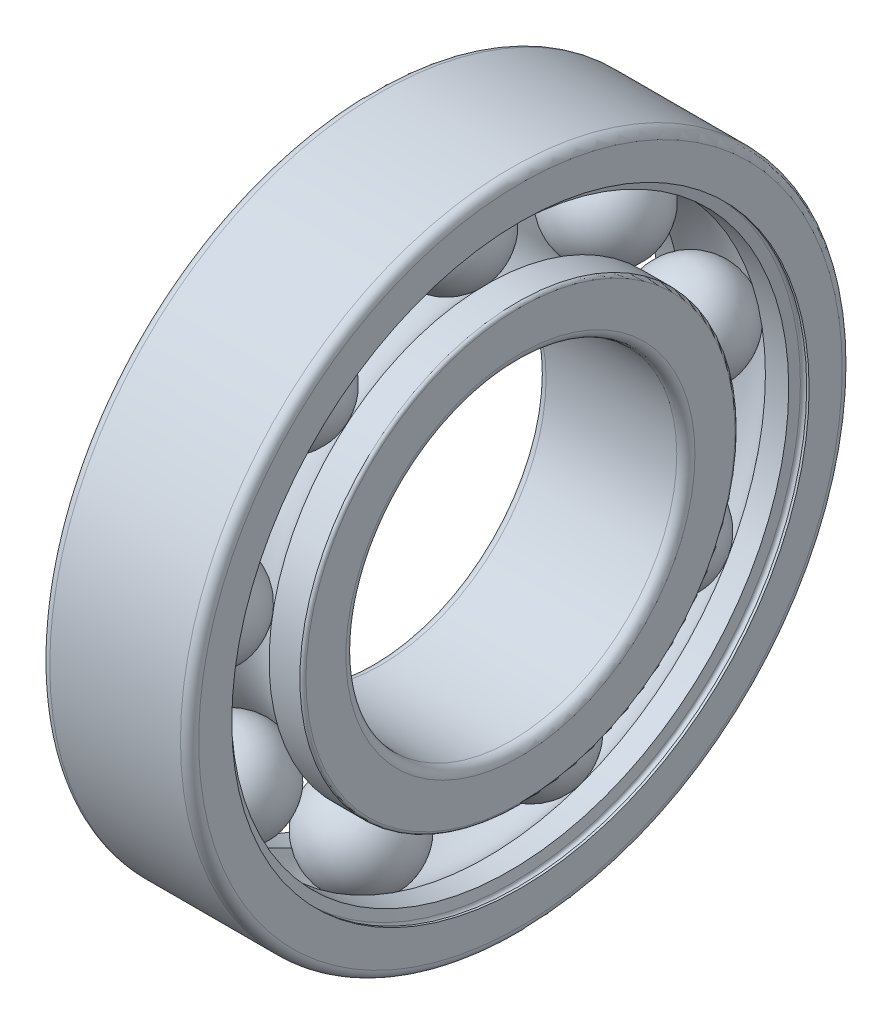
ISO-10303-21;
HEADER;
FILE_DESCRIPTION(('STEP AP214'),'2;1');
FILE_NAME('part.step','',(''),(''),'','','');
FILE_SCHEMA(('AUTOMOTIVE_DESIGN { 1 0 10303 214 1 1 1 1 }'));
ENDSEC;
DATA;
#1=APPLICATION_CONTEXT('core data for automotive mechanical design processes');
#2=APPLICATION_PROTOCOL_DEFINITION('international standard','automotive_design',2000,#1);
#3=PRODUCT_CONTEXT('',#1,'mechanical');
#4=PRODUCT('Part','Part','',(#3));
#5=PRODUCT_RELATED_PRODUCT_CATEGORY('part','',(#4));
#6=PRODUCT_DEFINITION_FORMATION('','',#4);
#7=PRODUCT_DEFINITION_CONTEXT('part definition',#1,'design');
#8=PRODUCT_DEFINITION('design','',#6,#7);
#9=PRODUCT_DEFINITION_SHAPE('','',#8);
#10=(LENGTH_UNIT() NAMED_UNIT(*) SI_UNIT(.MILLI.,.METRE.));
#11=(NAMED_UNIT(*) PLANE_ANGLE_UNIT() SI_UNIT($,.RADIAN.));
#12=(NAMED_UNIT(*) SI_UNIT($,.STERADIAN.) SOLID_ANGLE_UNIT());
#13=UNCERTAINTY_MEASURE_WITH_UNIT(LENGTH_MEASURE(1.E-05),#10,'distance_accuracy_value','');
#14=(GEOMETRIC_REPRESENTATION_CONTEXT(3) GLOBAL_UNCERTAINTY_ASSIGNED_CONTEXT((#13)) GLOBAL_UNIT_ASSIGNED_CONTEXT((#10,
#11,#12)) REPRESENTATION_CONTEXT('',''));
#15=CARTESIAN_POINT('',(0.,0.,0.));
#16=DIRECTION('',(0.,0.,1.));
#17=DIRECTION('',(1.,0.,0.));
#18=AXIS2_PLACEMENT_3D('',#15,#16,#17);
#19=CARTESIAN_POINT('',(1.10000000000032,0.,0.));
#20=DIRECTION('',(1.,0.,0.));
#21=DIRECTION('',(0.,0.,-1.));
#22=AXIS2_PLACEMENT_3D('',#19,#20,#21);
#23=TOROIDAL_SURFACE('',#22,21.1000000000003,1.10000000000035);
#24=CARTESIAN_POINT('',(1.09999999999999,0.,0.));
#25=DIRECTION('',(1.,0.,0.));
#26=DIRECTION('',(0.,0.,-1.));
#27=AXIS2_PLACEMENT_3D('',#24,#25,#26);
#28=CIRCLE('',#27,20.);
#29=CARTESIAN_POINT('',(1.09999999999999,0.,-20.));
#30=VERTEX_POINT('',#29);
#31=EDGE_CURVE('P0_E9',#30,#30,#28,.T.);
#32=ORIENTED_EDGE('',*,*,#31,.T.);
#33=EDGE_LOOP('',(#32));
#34=FACE_BOUND('',#33,.T.);
#35=CARTESIAN_POINT('',(0.,0.,0.));
#36=DIRECTION('',(1.,0.,0.));
#37=DIRECTION('',(0.,0.,-1.));
#38=AXIS2_PLACEMENT_3D('',#35,#36,#37);
#39=CIRCLE('',#38,21.1);
#40=CARTESIAN_POINT('',(0.,0.,-21.1));
#41=VERTEX_POINT('',#40);
#42=EDGE_CURVE('P0_E48',#41,#41,#39,.T.);
#43=ORIENTED_EDGE('',*,*,#42,.F.);
#44=EDGE_LOOP('',(#43));
#45=FACE_BOUND('',#44,.T.);
#46=ADVANCED_FACE('P0_F14',(#34,#45),#23,.T.);
#47=CARTESIAN_POINT('',(16.9,0.,0.));
#48=DIRECTION('',(1.,0.,0.));
#49=DIRECTION('',(0.,0.,-1.));
#50=AXIS2_PLACEMENT_3D('',#47,#48,#49);
#51=CYLINDRICAL_SURFACE('',#50,20.);
#52=CARTESIAN_POINT('',(16.9,0.,0.));
#53=DIRECTION('',(1.,0.,0.));
#54=DIRECTION('',(0.,0.,-1.));
#55=AXIS2_PLACEMENT_3D('',#52,#53,#54);
#56=CIRCLE('',#55,20.);
#57=CARTESIAN_POINT('',(16.9,0.,-20.));
#58=VERTEX_POINT('',#57);
#59=EDGE_CURVE('P0_E20',#58,#58,#56,.T.);
#60=ORIENTED_EDGE('',*,*,#59,.T.);
#61=EDGE_LOOP('',(#60));
#62=FACE_BOUND('',#61,.T.);
#63=ORIENTED_EDGE('',*,*,#31,.F.);
#64=EDGE_LOOP('',(#63));
#65=FACE_BOUND('',#64,.T.);
#66=ADVANCED_FACE('P0_F56',(#62,#65),#51,.F.);
#67=CARTESIAN_POINT('',(16.8999999999993,0.,0.));
#68=DIRECTION('',(1.,0.,0.));
#69=DIRECTION('',(0.,0.,-1.));
#70=AXIS2_PLACEMENT_3D('',#67,#68,#69);
#71=TOROIDAL_SURFACE('',#70,21.1000000000007,1.10000000000069);
#72=CARTESIAN_POINT('',(18.,0.,0.));
#73=DIRECTION('',(1.,0.,0.));
#74=DIRECTION('',(0.,0.,-1.));
#75=AXIS2_PLACEMENT_3D('',#72,#73,#74);
#76=CIRCLE('',#75,21.1);
#77=CARTESIAN_POINT('',(18.,0.,-21.1));
#78=VERTEX_POINT('',#77);
#79=EDGE_CURVE('P0_E24',#78,#78,#76,.T.);
#80=ORIENTED_EDGE('',*,*,#79,.T.);
#81=EDGE_LOOP('',(#80));
#82=FACE_BOUND('',#81,.T.);
#83=ORIENTED_EDGE('',*,*,#59,.F.);
#84=EDGE_LOOP('',(#83));
#85=FACE_BOUND('',#84,.T.);
#86=ADVANCED_FACE('P0_F61',(#82,#85),#71,.T.);
#87=CARTESIAN_POINT('',(18.,21.1,0.));
#88=DIRECTION('',(1.,0.,0.));
#89=DIRECTION('',(0.,0.,-1.));
#90=AXIS2_PLACEMENT_3D('',#87,#88,#89);
#91=PLANE('',#90);
#92=CARTESIAN_POINT('',(18.,0.,0.));
#93=DIRECTION('',(1.,0.,0.));
#94=DIRECTION('',(0.,0.,-1.));
#95=AXIS2_PLACEMENT_3D('',#92,#93,#94);
#96=CIRCLE('',#95,25.933);
#97=CARTESIAN_POINT('',(18.,0.,-25.933));
#98=VERTEX_POINT('',#97);
#99=EDGE_CURVE('P0_E28',#98,#98,#96,.T.);
#100=ORIENTED_EDGE('',*,*,#99,.T.);
#101=EDGE_LOOP('',(#100));
#102=FACE_BOUND('',#101,.T.);
#103=ORIENTED_EDGE('',*,*,#79,.F.);
#104=EDGE_LOOP('',(#103));
#105=FACE_BOUND('',#104,.T.);
#106=ADVANCED_FACE('P0_F65',(#102,#105),#91,.T.);
#107=CARTESIAN_POINT('',(17.6329999999984,0.,0.));
#108=DIRECTION('',(1.,0.,0.));
#109=DIRECTION('',(0.,0.,-1.));
#110=AXIS2_PLACEMENT_3D('',#107,#108,#109);
#111=TOROIDAL_SURFACE('',#110,25.9329999999984,0.367000000001578);
#112=CARTESIAN_POINT('',(17.633,0.,0.));
#113=DIRECTION('',(1.,0.,0.));
#114=DIRECTION('',(0.,0.,-1.));
#115=AXIS2_PLACEMENT_3D('',#112,#113,#114);
#116=CIRCLE('',#115,26.3);
#117=CARTESIAN_POINT('',(17.633,0.,-26.3));
#118=VERTEX_POINT('',#117);
#119=EDGE_CURVE('P0_E33',#118,#118,#116,.T.);
#120=ORIENTED_EDGE('',*,*,#119,.T.);
#121=EDGE_LOOP('',(#120));
#122=FACE_BOUND('',#121,.T.);
#123=ORIENTED_EDGE('',*,*,#99,.F.);
#124=EDGE_LOOP('',(#123));
#125=FACE_BOUND('',#124,.T.);
#126=ADVANCED_FACE('P0_F72',(#122,#125),#111,.T.);
#127=CARTESIAN_POINT('',(16.9,0.,0.));
#128=DIRECTION('',(1.,0.,0.));
#129=DIRECTION('',(0.,0.,-1.));
#130=AXIS2_PLACEMENT_3D('',#127,#128,#129);
#131=CYLINDRICAL_SURFACE('',#130,26.3);
#132=CARTESIAN_POINT('',(13.914987690727,0.,0.));
#133=DIRECTION('',(1.,0.,0.));
#134=DIRECTION('',(0.,0.,-1.));
#135=AXIS2_PLACEMENT_3D('',#132,#133,#134);
#136=CIRCLE('',#135,26.3);
#137=CARTESIAN_POINT('',(13.914987690727,0.,-26.3));
#138=VERTEX_POINT('',#137);
#139=EDGE_CURVE('P0_E36',#138,#138,#136,.T.);
#140=ORIENTED_EDGE('',*,*,#139,.T.);
#141=EDGE_LOOP('',(#140));
#142=FACE_BOUND('',#141,.T.);
#143=ORIENTED_EDGE('',*,*,#119,.F.);
#144=EDGE_LOOP('',(#143));
#145=FACE_BOUND('',#144,.T.);
#146=ADVANCED_FACE('P0_F76',(#142,#145),#131,.T.);
#147=CARTESIAN_POINT('',(8.9999999999999,0.,0.));
#148=DIRECTION('',(1.,0.,0.));
#149=DIRECTION('',(0.,0.,-1.));
#150=AXIS2_PLACEMENT_3D('',#147,#148,#149);
#151=TOROIDAL_SURFACE('',#150,29.9999999999998,6.15199999999978);
#152=CARTESIAN_POINT('',(4.08501230927283,0.,0.));
#153=DIRECTION('',(1.,0.,0.));
#154=DIRECTION('',(0.,0.,-1.));
#155=AXIS2_PLACEMENT_3D('',#152,#153,#154);
#156=CIRCLE('',#155,26.3);
#157=CARTESIAN_POINT('',(4.08501230927283,0.,-26.3));
#158=VERTEX_POINT('',#157);
#159=EDGE_CURVE('P0_E39',#158,#158,#156,.T.);
#160=ORIENTED_EDGE('',*,*,#159,.T.);
#161=EDGE_LOOP('',(#160));
#162=FACE_BOUND('',#161,.T.);
#163=ORIENTED_EDGE('',*,*,#139,.F.);
#164=EDGE_LOOP('',(#163));
#165=FACE_BOUND('',#164,.T.);
#166=ADVANCED_FACE('P0_F80',(#162,#165),#151,.F.);
#167=CARTESIAN_POINT('',(16.9,0.,0.));
#168=DIRECTION('',(1.,0.,0.));
#169=DIRECTION('',(0.,0.,-1.));
#170=AXIS2_PLACEMENT_3D('',#167,#168,#169);
#171=CYLINDRICAL_SURFACE('',#170,26.3);
#172=CARTESIAN_POINT('',(0.367000000000006,0.,0.));
#173=DIRECTION('',(1.,0.,0.));
#174=DIRECTION('',(0.,0.,-1.));
#175=AXIS2_PLACEMENT_3D('',#172,#173,#174);
#176=CIRCLE('',#175,26.3);
#177=CARTESIAN_POINT('',(0.367000000000006,0.,-26.3));
#178=VERTEX_POINT('',#177);
#179=EDGE_CURVE('P0_E42',#178,#178,#176,.T.);
#180=ORIENTED_EDGE('',*,*,#179,.T.);
#181=EDGE_LOOP('',(#180));
#182=FACE_BOUND('',#181,.T.);
#183=ORIENTED_EDGE('',*,*,#159,.F.);
#184=EDGE_LOOP('',(#183));
#185=FACE_BOUND('',#184,.T.);
#186=ADVANCED_FACE('P0_F84',(#182,#185),#171,.T.);
#187=CARTESIAN_POINT('',(0.367000000000783,0.,0.));
#188=DIRECTION('',(1.,0.,0.));
#189=DIRECTION('',(0.,0.,-1.));
#190=AXIS2_PLACEMENT_3D('',#187,#188,#189);
#191=TOROIDAL_SURFACE('',#190,25.9329999999992,0.367000000000794);
#192=CARTESIAN_POINT('',(0.,0.,0.));
#193=DIRECTION('',(1.,0.,0.));
#194=DIRECTION('',(0.,0.,-1.));
#195=AXIS2_PLACEMENT_3D('',#192,#193,#194);
#196=CIRCLE('',#195,25.933);
#197=CARTESIAN_POINT('',(0.,0.,-25.933));
#198=VERTEX_POINT('',#197);
#199=EDGE_CURVE('P0_E45',#198,#198,#196,.T.);
#200=ORIENTED_EDGE('',*,*,#199,.T.);
#201=EDGE_LOOP('',(#200));
#202=FACE_BOUND('',#201,.T.);
#203=ORIENTED_EDGE('',*,*,#179,.F.);
#204=EDGE_LOOP('',(#203));
#205=FACE_BOUND('',#204,.T.);
#206=ADVANCED_FACE('P0_F88',(#202,#205),#191,.T.);
#207=CARTESIAN_POINT('',(0.,25.933,0.));
#208=DIRECTION('',(-1.,0.,0.));
#209=DIRECTION('',(0.,0.,1.));
#210=AXIS2_PLACEMENT_3D('',#207,#208,#209);
#211=PLANE('',#210);
#212=ORIENTED_EDGE('',*,*,#42,.T.);
#213=EDGE_LOOP('',(#212));
#214=FACE_BOUND('',#213,.T.);
#215=ORIENTED_EDGE('',*,*,#199,.F.);
#216=EDGE_LOOP('',(#215));
#217=FACE_BOUND('',#216,.T.);
#218=ADVANCED_FACE('P0_F52',(#214,#217),#211,.T.);
#219=CLOSED_SHELL('',(#46,#66,#86,#106,#126,#146,#166,#186,#206,#218));
#220=MANIFOLD_SOLID_BREP('P0_B1',#219);
#221=CARTESIAN_POINT('',(1.10000000000032,0.,0.));
#222=DIRECTION('',(1.,0.,0.));
#223=DIRECTION('',(0.,0.,-1.));
#224=AXIS2_PLACEMENT_3D('',#221,#222,#223);
#225=TOROIDAL_SURFACE('',#224,38.8999999999997,1.10000000000034);
#226=CARTESIAN_POINT('',(0.,0.,0.));
#227=DIRECTION('',(1.,0.,0.));
#228=DIRECTION('',(0.,0.,-1.));
#229=AXIS2_PLACEMENT_3D('',#226,#227,#228);
#230=CIRCLE('',#229,38.9);
#231=CARTESIAN_POINT('',(0.,0.,-38.9));
#232=VERTEX_POINT('',#231);
#233=EDGE_CURVE('P1_E10',#232,#232,#230,.T.);
#234=ORIENTED_EDGE('',*,*,#233,.T.);
#235=EDGE_LOOP('',(#234));
#236=FACE_BOUND('',#235,.T.);
#237=CARTESIAN_POINT('',(1.09999999999999,0.,0.));
#238=DIRECTION('',(1.,0.,0.));
#239=DIRECTION('',(0.,0.,-1.));
#240=AXIS2_PLACEMENT_3D('',#237,#238,#239);
#241=CIRCLE('',#240,40.);
#242=CARTESIAN_POINT('',(1.09999999999999,0.,-40.));
#243=VERTEX_POINT('',#242);
#244=EDGE_CURVE('P1_E61',#243,#243,#241,.T.);
#245=ORIENTED_EDGE('',*,*,#244,.F.);
#246=EDGE_LOOP('',(#245));
#247=FACE_BOUND('',#246,.T.);
#248=ADVANCED_FACE('P1_F15',(#236,#247),#225,.T.);
#249=CARTESIAN_POINT('',(0.,38.9,0.));
#250=DIRECTION('',(-1.,0.,0.));
#251=DIRECTION('',(0.,0.,1.));
#252=AXIS2_PLACEMENT_3D('',#249,#250,#251);
#253=PLANE('',#252);
#254=CARTESIAN_POINT('',(0.,0.,0.));
#255=DIRECTION('',(1.,0.,0.));
#256=DIRECTION('',(0.,0.,-1.));
#257=AXIS2_PLACEMENT_3D('',#254,#255,#256);
#258=CIRCLE('',#257,34.9);
#259=CARTESIAN_POINT('',(0.,0.,-34.9));
#260=VERTEX_POINT('',#259);
#261=EDGE_CURVE('P1_E21',#260,#260,#258,.T.);
#262=ORIENTED_EDGE('',*,*,#261,.T.);
#263=EDGE_LOOP('',(#262));
#264=FACE_BOUND('',#263,.T.);
#265=ORIENTED_EDGE('',*,*,#233,.F.);
#266=EDGE_LOOP('',(#265));
#267=FACE_BOUND('',#266,.T.);
#268=ADVANCED_FACE('P1_F69',(#264,#267),#253,.T.);
#269=CARTESIAN_POINT('',(16.9,0.,0.));
#270=DIRECTION('',(1.,0.,0.));
#271=DIRECTION('',(0.,0.,-1.));
#272=AXIS2_PLACEMENT_3D('',#269,#270,#271);
#273=CYLINDRICAL_SURFACE('',#272,34.9);
#274=CARTESIAN_POINT('',(0.295555555555549,0.,0.));
#275=DIRECTION('',(1.,0.,0.));
#276=DIRECTION('',(0.,0.,-1.));
#277=AXIS2_PLACEMENT_3D('',#274,#275,#276);
#278=CIRCLE('',#277,34.9);
#279=CARTESIAN_POINT('',(0.295555555555549,0.,-34.9));
#280=VERTEX_POINT('',#279);
#281=EDGE_CURVE('P1_E25',#280,#280,#278,.T.);
#282=ORIENTED_EDGE('',*,*,#281,.T.);
#283=EDGE_LOOP('',(#282));
#284=FACE_BOUND('',#283,.T.);
#285=ORIENTED_EDGE('',*,*,#261,.F.);
#286=EDGE_LOOP('',(#285));
#287=FACE_BOUND('',#286,.T.);
#288=ADVANCED_FACE('P1_F74',(#284,#287),#273,.F.);
#289=CARTESIAN_POINT('',(0.675555555555596,0.,0.));
#290=DIRECTION('',(1.,0.,0.));
#291=DIRECTION('',(0.,0.,-1.));
#292=AXIS2_PLACEMENT_3D('',#289,#290,#291);
#293=TOROIDAL_SURFACE('',#292,34.9,0.380000000000025);
#294=CARTESIAN_POINT('',(1.05555555555559,0.,0.));
#295=DIRECTION('',(1.,0.,0.));
#296=DIRECTION('',(0.,0.,-1.));
#297=AXIS2_PLACEMENT_3D('',#294,#295,#296);
#298=CIRCLE('',#297,34.9);
#299=CARTESIAN_POINT('',(1.05555555555559,0.,-34.9));
#300=VERTEX_POINT('',#299);
#301=EDGE_CURVE('P1_E29',#300,#300,#298,.T.);
#302=ORIENTED_EDGE('',*,*,#301,.T.);
#303=EDGE_LOOP('',(#302));
#304=FACE_BOUND('',#303,.T.);
#305=ORIENTED_EDGE('',*,*,#281,.F.);
#306=EDGE_LOOP('',(#305));
#307=FACE_BOUND('',#306,.T.);
#308=ADVANCED_FACE('P1_F78',(#304,#307),#293,.F.);
#309=CARTESIAN_POINT('',(1.05555555555559,0.,0.));
#310=DIRECTION('',(-1.,0.,0.));
#311=DIRECTION('',(0.,0.,1.));
#312=AXIS2_PLACEMENT_3D('',#309,#310,#311);
#313=CONICAL_SURFACE('',#312,34.9,1.39626340159551);
#314=CARTESIAN_POINT('',(1.26714793240568,0.,0.));
#315=DIRECTION('',(1.,0.,0.));
#316=DIRECTION('',(0.,0.,-1.));
#317=AXIS2_PLACEMENT_3D('',#314,#315,#316);
#318=CIRCLE('',#317,33.7);
#319=CARTESIAN_POINT('',(1.26714793240568,0.,-33.7));
#320=VERTEX_POINT('',#319);
#321=EDGE_CURVE('P1_E34',#320,#320,#318,.T.);
#322=ORIENTED_EDGE('',*,*,#321,.T.);
#323=EDGE_LOOP('',(#322));
#324=FACE_BOUND('',#323,.T.);
#325=ORIENTED_EDGE('',*,*,#301,.F.);
#326=EDGE_LOOP('',(#325));
#327=FACE_BOUND('',#326,.T.);
#328=ADVANCED_FACE('P1_F85',(#324,#327),#313,.F.);
#329=CARTESIAN_POINT('',(16.9,0.,0.));
#330=DIRECTION('',(1.,0.,0.));
#331=DIRECTION('',(0.,0.,-1.));
#332=AXIS2_PLACEMENT_3D('',#329,#330,#331);
#333=CYLINDRICAL_SURFACE('',#332,33.7);
#334=CARTESIAN_POINT('',(4.08501230927283,0.,0.));
#335=DIRECTION('',(1.,0.,0.));
#336=DIRECTION('',(0.,0.,-1.));
#337=AXIS2_PLACEMENT_3D('',#334,#335,#336);
#338=CIRCLE('',#337,33.7);
#339=CARTESIAN_POINT('',(4.08501230927283,0.,-33.7));
#340=VERTEX_POINT('',#339);
#341=EDGE_CURVE('P1_E37',#340,#340,#338,.T.);
#342=ORIENTED_EDGE('',*,*,#341,.T.);
#343=EDGE_LOOP('',(#342));
#344=FACE_BOUND('',#343,.T.);
#345=ORIENTED_EDGE('',*,*,#321,.F.);
#346=EDGE_LOOP('',(#345));
#347=FACE_BOUND('',#346,.T.);
#348=ADVANCED_FACE('P1_F89',(#344,#347),#333,.F.);
#349=CARTESIAN_POINT('',(8.9999999999999,0.,0.));
#350=DIRECTION('',(1.,0.,0.));
#351=DIRECTION('',(0.,0.,-1.));
#352=AXIS2_PLACEMENT_3D('',#349,#350,#351);
#353=TOROIDAL_SURFACE('',#352,30.0000000000002,6.15199999999979);
#354=CARTESIAN_POINT('',(13.914987690727,0.,0.));
#355=DIRECTION('',(1.,0.,0.));
#356=DIRECTION('',(0.,0.,-1.));
#357=AXIS2_PLACEMENT_3D('',#354,#355,#356);
#358=CIRCLE('',#357,33.7);
#359=CARTESIAN_POINT('',(13.914987690727,0.,-33.7));
#360=VERTEX_POINT('',#359);
#361=EDGE_CURVE('P1_E40',#360,#360,#358,.T.);
#362=ORIENTED_EDGE('',*,*,#361,.T.);
#363=EDGE_LOOP('',(#362));
#364=FACE_BOUND('',#363,.T.);
#365=ORIENTED_EDGE('',*,*,#341,.F.);
#366=EDGE_LOOP('',(#365));
#367=FACE_BOUND('',#366,.T.);
#368=ADVANCED_FACE('P1_F93',(#364,#367),#353,.F.);
#369=CARTESIAN_POINT('',(16.9,0.,0.));
#370=DIRECTION('',(1.,0.,0.));
#371=DIRECTION('',(0.,0.,-1.));
#372=AXIS2_PLACEMENT_3D('',#369,#370,#371);
#373=CYLINDRICAL_SURFACE('',#372,33.7);
#374=CARTESIAN_POINT('',(16.732852067594,0.,0.));
#375=DIRECTION('',(1.,0.,0.));
#376=DIRECTION('',(0.,0.,-1.));
#377=AXIS2_PLACEMENT_3D('',#374,#375,#376);
#378=CIRCLE('',#377,33.7);
#379=CARTESIAN_POINT('',(16.732852067594,0.,-33.7));
#380=VERTEX_POINT('',#379);
#381=EDGE_CURVE('P1_E43',#380,#380,#378,.T.);
#382=ORIENTED_EDGE('',*,*,#381,.T.);
#383=EDGE_LOOP('',(#382));
#384=FACE_BOUND('',#383,.T.);
#385=ORIENTED_EDGE('',*,*,#361,.F.);
#386=EDGE_LOOP('',(#385));
#387=FACE_BOUND('',#386,.T.);
#388=ADVANCED_FACE('P1_F97',(#384,#387),#373,.F.);
#389=CARTESIAN_POINT('',(16.732852067594,0.,0.));
#390=DIRECTION('',(1.,0.,0.));
#391=DIRECTION('',(0.,0.,-1.));
#392=AXIS2_PLACEMENT_3D('',#389,#390,#391);
#393=CONICAL_SURFACE('',#392,33.7,1.39626340159559);
#394=CARTESIAN_POINT('',(16.944444444444,0.,0.));
#395=DIRECTION('',(1.,0.,0.));
#396=DIRECTION('',(0.,0.,-1.));
#397=AXIS2_PLACEMENT_3D('',#394,#395,#396);
#398=CIRCLE('',#397,34.9);
#399=CARTESIAN_POINT('',(16.944444444444,0.,-34.9));
#400=VERTEX_POINT('',#399);
#401=EDGE_CURVE('P1_E46',#400,#400,#398,.T.);
#402=ORIENTED_EDGE('',*,*,#401,.T.);
#403=EDGE_LOOP('',(#402));
#404=FACE_BOUND('',#403,.T.);
#405=ORIENTED_EDGE('',*,*,#381,.F.);
#406=EDGE_LOOP('',(#405));
#407=FACE_BOUND('',#406,.T.);
#408=ADVANCED_FACE('P1_F101',(#404,#407),#393,.F.);
#409=CARTESIAN_POINT('',(17.324444444444,0.,0.));
#410=DIRECTION('',(1.,0.,0.));
#411=DIRECTION('',(0.,0.,-1.));
#412=AXIS2_PLACEMENT_3D('',#409,#410,#411);
#413=TOROIDAL_SURFACE('',#412,34.900000027375,0.380000000000001);
#414=CARTESIAN_POINT('',(17.704444444444,0.,0.));
#415=DIRECTION('',(1.,0.,0.));
#416=DIRECTION('',(0.,0.,-1.));
#417=AXIS2_PLACEMENT_3D('',#414,#415,#416);
#418=CIRCLE('',#417,34.9);
#419=CARTESIAN_POINT('',(17.704444444444,0.,-34.9));
#420=VERTEX_POINT('',#419);
#421=EDGE_CURVE('P1_E49',#420,#420,#418,.T.);
#422=ORIENTED_EDGE('',*,*,#421,.T.);
#423=EDGE_LOOP('',(#422));
#424=FACE_BOUND('',#423,.T.);
#425=ORIENTED_EDGE('',*,*,#401,.F.);
#426=EDGE_LOOP('',(#425));
#427=FACE_BOUND('',#426,.T.);
#428=ADVANCED_FACE('P1_F105',(#424,#427),#413,.F.);
#429=CARTESIAN_POINT('',(16.9,0.,0.));
#430=DIRECTION('',(1.,0.,0.));
#431=DIRECTION('',(0.,0.,-1.));
#432=AXIS2_PLACEMENT_3D('',#429,#430,#431);
#433=CYLINDRICAL_SURFACE('',#432,34.9);
#434=CARTESIAN_POINT('',(18.,0.,0.));
#435=DIRECTION('',(1.,0.,0.));
#436=DIRECTION('',(0.,0.,-1.));
#437=AXIS2_PLACEMENT_3D('',#434,#435,#436);
#438=CIRCLE('',#437,34.9);
#439=CARTESIAN_POINT('',(18.,0.,-34.9));
#440=VERTEX_POINT('',#439);
#441=EDGE_CURVE('P1_E52',#440,#440,#438,.T.);
#442=ORIENTED_EDGE('',*,*,#441,.T.);
#443=EDGE_LOOP('',(#442));
#444=FACE_BOUND('',#443,.T.);
#445=ORIENTED_EDGE('',*,*,#421,.F.);
#446=EDGE_LOOP('',(#445));
#447=FACE_BOUND('',#446,.T.);
#448=ADVANCED_FACE('P1_F109',(#444,#447),#433,.F.);
#449=CARTESIAN_POINT('',(18.,34.9,0.));
#450=DIRECTION('',(1.,0.,0.));
#451=DIRECTION('',(0.,0.,-1.));
#452=AXIS2_PLACEMENT_3D('',#449,#450,#451);
#453=PLANE('',#452);
#454=CARTESIAN_POINT('',(18.,0.,0.));
#455=DIRECTION('',(1.,0.,0.));
#456=DIRECTION('',(0.,0.,-1.));
#457=AXIS2_PLACEMENT_3D('',#454,#455,#456);
#458=CIRCLE('',#457,38.9);
#459=CARTESIAN_POINT('',(18.,0.,-38.9));
#460=VERTEX_POINT('',#459);
#461=EDGE_CURVE('P1_E55',#460,#460,#458,.T.);
#462=ORIENTED_EDGE('',*,*,#461,.T.);
#463=EDGE_LOOP('',(#462));
#464=FACE_BOUND('',#463,.T.);
#465=ORIENTED_EDGE('',*,*,#441,.F.);
#466=EDGE_LOOP('',(#465));
#467=FACE_BOUND('',#466,.T.);
#468=ADVANCED_FACE('P1_F113',(#464,#467),#453,.T.);
#469=CARTESIAN_POINT('',(16.8999999999993,0.,0.));
#470=DIRECTION('',(1.,0.,0.));
#471=DIRECTION('',(0.,0.,-1.));
#472=AXIS2_PLACEMENT_3D('',#469,#470,#471);
#473=TOROIDAL_SURFACE('',#472,38.8999999999993,1.10000000000069);
#474=CARTESIAN_POINT('',(16.9,0.,0.));
#475=DIRECTION('',(1.,0.,0.));
#476=DIRECTION('',(0.,0.,-1.));
#477=AXIS2_PLACEMENT_3D('',#474,#475,#476);
#478=CIRCLE('',#477,40.);
#479=CARTESIAN_POINT('',(16.9,0.,-40.));
#480=VERTEX_POINT('',#479);
#481=EDGE_CURVE('P1_E58',#480,#480,#478,.T.);
#482=ORIENTED_EDGE('',*,*,#481,.T.);
#483=EDGE_LOOP('',(#482));
#484=FACE_BOUND('',#483,.T.);
#485=ORIENTED_EDGE('',*,*,#461,.F.);
#486=EDGE_LOOP('',(#485));
#487=FACE_BOUND('',#486,.T.);
#488=ADVANCED_FACE('P1_F117',(#484,#487),#473,.T.);
#489=CARTESIAN_POINT('',(16.9,0.,0.));
#490=DIRECTION('',(1.,0.,0.));
#491=DIRECTION('',(0.,0.,-1.));
#492=AXIS2_PLACEMENT_3D('',#489,#490,#491);
#493=CYLINDRICAL_SURFACE('',#492,40.);
#494=ORIENTED_EDGE('',*,*,#244,.T.);
#495=EDGE_LOOP('',(#494));
#496=FACE_BOUND('',#495,.T.);
#497=ORIENTED_EDGE('',*,*,#481,.F.);
#498=EDGE_LOOP('',(#497));
#499=FACE_BOUND('',#498,.T.);
#500=ADVANCED_FACE('P1_F65',(#496,#499),#493,.T.);
#501=CLOSED_SHELL('',(#248,#268,#288,#308,#328,#348,#368,#388,#408,#428,#448,#468,#488,#500));
#502=MANIFOLD_SOLID_BREP('P1_B1',#501);
#503=CARTESIAN_POINT('',(9.00000000000001,30.,0.));
#504=DIRECTION('',(1.,0.,0.));
#505=DIRECTION('',(0.,1.,0.));
#506=AXIS2_PLACEMENT_3D('',#503,#504,#505);
#507=SPHERICAL_SURFACE('',#506,6.152);
#508=CARTESIAN_POINT('',(15.152,30.,0.));
#509=VERTEX_POINT('',#508);
#510=VERTEX_LOOP('',#509);
#511=FACE_BOUND('',#510,.T.);
#512=ADVANCED_FACE('P2_F13',(#511),#507,.T.);
#513=CLOSED_SHELL('',(#512));
#514=MANIFOLD_SOLID_BREP('P2_B1',#513);
#515=CARTESIAN_POINT('',(9.00000000000001,22.9813332935693,-19.2836282905961));
#516=DIRECTION('',(1.,0.,0.));
#517=DIRECTION('',(0.,0.766044443118979,-0.642787609686539));
#518=AXIS2_PLACEMENT_3D('',#515,#516,#517);
#519=SPHERICAL_SURFACE('',#518,6.152);
#520=CARTESIAN_POINT('',(15.152,22.9813332935693,-19.2836282905961));
#521=VERTEX_POINT('',#520);
#522=VERTEX_LOOP('',#521);
#523=FACE_BOUND('',#522,.T.);
#524=ADVANCED_FACE('P3_F13',(#523),#519,.T.);
#525=CLOSED_SHELL('',(#524));
#526=MANIFOLD_SOLID_BREP('P3_B1',#525);
#527=CARTESIAN_POINT('',(9.00000000000001,5.20944533000789,-29.5442325903662));
#528=DIRECTION('',(1.,0.,0.));
#529=DIRECTION('',(0.,0.17364817766693,-0.984807753012208));
#530=AXIS2_PLACEMENT_3D('',#527,#528,#529);
#531=SPHERICAL_SURFACE('',#530,6.152);
#532=CARTESIAN_POINT('',(15.152,5.20944533000789,-29.5442325903662));
#533=VERTEX_POINT('',#532);
#534=VERTEX_LOOP('',#533);
#535=FACE_BOUND('',#534,.T.);
#536=ADVANCED_FACE('P4_F13',(#535),#531,.T.);
#537=CLOSED_SHELL('',(#536));
#538=MANIFOLD_SOLID_BREP('P4_B1',#537);
#539=CARTESIAN_POINT('',(9.00000000000001,-15.,-25.9807621135332));
#540=DIRECTION('',(1.,0.,0.));
#541=DIRECTION('',(0.,-0.5,-0.866025403784439));
#542=AXIS2_PLACEMENT_3D('',#539,#540,#541);
#543=SPHERICAL_SURFACE('',#542,6.152);
#544=CARTESIAN_POINT('',(15.152,-15.,-25.9807621135332));
#545=VERTEX_POINT('',#544);
#546=VERTEX_LOOP('',#545);
#547=FACE_BOUND('',#546,.T.);
#548=ADVANCED_FACE('P5_F13',(#547),#543,.T.);
#549=CLOSED_SHELL('',(#548));
#550=MANIFOLD_SOLID_BREP('P5_B1',#549);
#551=CARTESIAN_POINT('',(9.00000000000001,-28.1907786235772,-10.2606042997701));
#552=DIRECTION('',(1.,0.,0.));
#553=DIRECTION('',(0.,-0.939692620785909,-0.342020143325669));
#554=AXIS2_PLACEMENT_3D('',#551,#552,#553);
#555=SPHERICAL_SURFACE('',#554,6.152);
#556=CARTESIAN_POINT('',(15.152,-28.1907786235772,-10.2606042997701));
#557=VERTEX_POINT('',#556);
#558=VERTEX_LOOP('',#557);
#559=FACE_BOUND('',#558,.T.);
#560=ADVANCED_FACE('P6_F13',(#559),#555,.T.);
#561=CLOSED_SHELL('',(#560));
#562=MANIFOLD_SOLID_BREP('P6_B1',#561);
#563=CARTESIAN_POINT('',(9.00000000000001,-28.1907786235772,10.2606042997701));
#564=DIRECTION('',(1.,0.,0.));
#565=DIRECTION('',(0.,-0.939692620785908,0.342020143325669));
#566=AXIS2_PLACEMENT_3D('',#563,#564,#565);
#567=SPHERICAL_SURFACE('',#566,6.152);
#568=CARTESIAN_POINT('',(15.152,-28.1907786235772,10.2606042997701));
#569=VERTEX_POINT('',#568);
#570=VERTEX_LOOP('',#569);
#571=FACE_BOUND('',#570,.T.);
#572=ADVANCED_FACE('P7_F13',(#571),#567,.T.);
#573=CLOSED_SHELL('',(#572));
#574=MANIFOLD_SOLID_BREP('P7_B1',#573);
#575=CARTESIAN_POINT('',(9.00000000000001,-15.,25.9807621135332));
#576=DIRECTION('',(1.,0.,0.));
#577=DIRECTION('',(0.,-0.5,0.866025403784439));
#578=AXIS2_PLACEMENT_3D('',#575,#576,#577);
#579=SPHERICAL_SURFACE('',#578,6.152);
#580=CARTESIAN_POINT('',(15.152,-15.,25.9807621135332));
#581=VERTEX_POINT('',#580);
#582=VERTEX_LOOP('',#581);
#583=FACE_BOUND('',#582,.T.);
#584=ADVANCED_FACE('P8_F13',(#583),#579,.T.);
#585=CLOSED_SHELL('',(#584));
#586=MANIFOLD_SOLID_BREP('P8_B1',#585);
#587=CARTESIAN_POINT('',(9.00000000000001,5.20944533000789,29.5442325903662));
#588=DIRECTION('',(1.,0.,0.));
#589=DIRECTION('',(0.,0.17364817766693,0.984807753012208));
#590=AXIS2_PLACEMENT_3D('',#587,#588,#589);
#591=SPHERICAL_SURFACE('',#590,6.152);
#592=CARTESIAN_POINT('',(15.152,5.20944533000789,29.5442325903662));
#593=VERTEX_POINT('',#592);
#594=VERTEX_LOOP('',#593);
#595=FACE_BOUND('',#594,.T.);
#596=ADVANCED_FACE('P9_F13',(#595),#591,.T.);
#597=CLOSED_SHELL('',(#596));
#598=MANIFOLD_SOLID_BREP('P9_B1',#597);
#599=CARTESIAN_POINT('',(9.00000000000001,22.9813332935694,19.2836282905962));
#600=DIRECTION('',(1.,0.,0.));
#601=DIRECTION('',(0.,0.766044443118979,0.642787609686539));
#602=AXIS2_PLACEMENT_3D('',#599,#600,#601);
#603=SPHERICAL_SURFACE('',#602,6.152);
#604=CARTESIAN_POINT('',(15.152,22.9813332935694,19.2836282905962));
#605=VERTEX_POINT('',#604);
#606=VERTEX_LOOP('',#605);
#607=FACE_BOUND('',#606,.T.);
#608=ADVANCED_FACE('P10_F13',(#607),#603,.T.);
#609=CLOSED_SHELL('',(#608));
#610=MANIFOLD_SOLID_BREP('P10_B1',#609);
#611=ADVANCED_BREP_SHAPE_REPRESENTATION('',(#18,#220,#502,#514,#526,#538,#550,#562,#574,#586,
#598,#610),#14);
#612=SHAPE_DEFINITION_REPRESENTATION(#9,#611);
ENDSEC;
END-ISO-10303-21;
